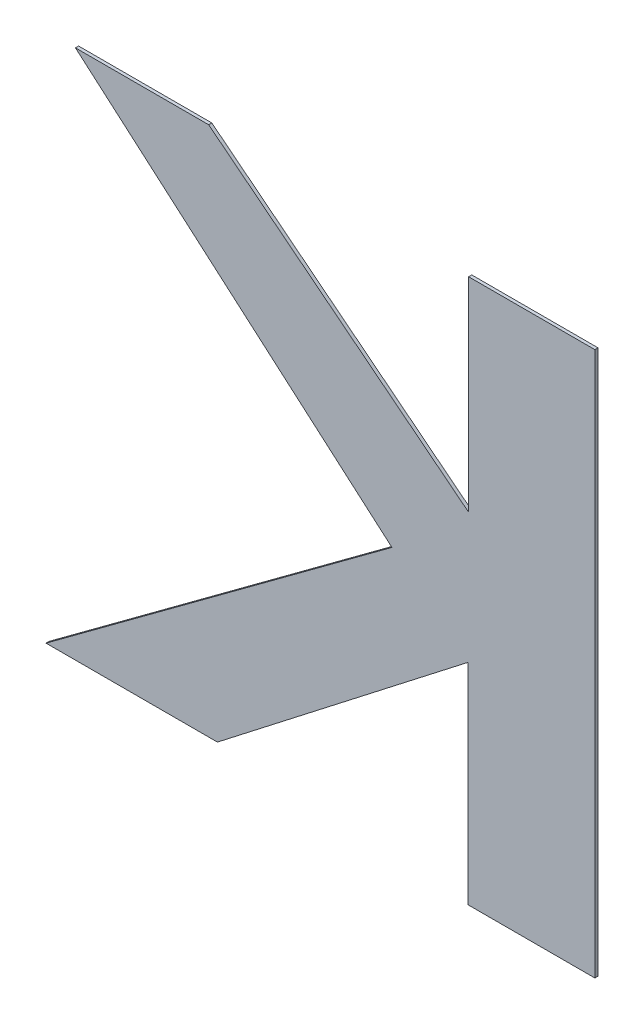
ISO-10303-21;
HEADER;
FILE_DESCRIPTION(('STEP AP214'),'2;1');
FILE_NAME('part.step','',(''),(''),'','','');
FILE_SCHEMA(('AUTOMOTIVE_DESIGN { 1 0 10303 214 1 1 1 1 }'));
ENDSEC;
DATA;
#1=APPLICATION_CONTEXT('core data for automotive mechanical design processes');
#2=APPLICATION_PROTOCOL_DEFINITION('international standard','automotive_design',2000,#1);
#3=PRODUCT_CONTEXT('',#1,'mechanical');
#4=PRODUCT('Part','Part','',(#3));
#5=PRODUCT_RELATED_PRODUCT_CATEGORY('part','',(#4));
#6=PRODUCT_DEFINITION_FORMATION('','',#4);
#7=PRODUCT_DEFINITION_CONTEXT('part definition',#1,'design');
#8=PRODUCT_DEFINITION('design','',#6,#7);
#9=PRODUCT_DEFINITION_SHAPE('','',#8);
#10=(LENGTH_UNIT() NAMED_UNIT(*) SI_UNIT(.MILLI.,.METRE.));
#11=(NAMED_UNIT(*) PLANE_ANGLE_UNIT() SI_UNIT($,.RADIAN.));
#12=(NAMED_UNIT(*) SI_UNIT($,.STERADIAN.) SOLID_ANGLE_UNIT());
#13=UNCERTAINTY_MEASURE_WITH_UNIT(LENGTH_MEASURE(1.E-05),#10,'distance_accuracy_value','');
#14=(GEOMETRIC_REPRESENTATION_CONTEXT(3) GLOBAL_UNCERTAINTY_ASSIGNED_CONTEXT((#13)) GLOBAL_UNIT_ASSIGNED_CONTEXT((#10,
#11,#12)) REPRESENTATION_CONTEXT('',''));
#15=CARTESIAN_POINT('',(0.,0.,0.));
#16=DIRECTION('',(0.,0.,1.));
#17=DIRECTION('',(1.,0.,0.));
#18=AXIS2_PLACEMENT_3D('',#15,#16,#17);
#19=CARTESIAN_POINT('',(0.27786395715,-16.68215910058,0.01));
#20=DIRECTION('',(0.,0.,1.));
#21=DIRECTION('',(1.,0.,0.));
#22=AXIS2_PLACEMENT_3D('',#19,#20,#21);
#23=PLANE('',#22);
#24=DIRECTION('',(0.,-1.,0.));
#25=VECTOR('',#24,1.);
#26=CARTESIAN_POINT('',(1.002394,-15.816008,0.01));
#27=LINE('',#26,#25);
#28=CARTESIAN_POINT('',(1.002394,-15.816008,0.01));
#29=VERTEX_POINT('',#28);
#30=CARTESIAN_POINT('',(1.002394,-17.548193,0.01));
#31=VERTEX_POINT('',#30);
#32=EDGE_CURVE('E133',#29,#31,#27,.T.);
#33=ORIENTED_EDGE('',*,*,#32,.F.);
#34=DIRECTION('',(1.,0.,0.));
#35=VECTOR('',#34,1.);
#36=CARTESIAN_POINT('',(0.600658,-15.816008,0.01));
#37=LINE('',#36,#35);
#38=CARTESIAN_POINT('',(0.600658,-15.816008,0.01));
#39=VERTEX_POINT('',#38);
#40=EDGE_CURVE('E27',#39,#29,#37,.T.);
#41=ORIENTED_EDGE('',*,*,#40,.F.);
#42=DIRECTION('',(0.,1.,0.));
#43=VECTOR('',#42,1.);
#44=CARTESIAN_POINT('',(0.600658,-16.465246,0.01));
#45=LINE('',#44,#43);
#46=CARTESIAN_POINT('',(0.600658,-16.465246,0.01));
#47=VERTEX_POINT('',#46);
#48=EDGE_CURVE('E104',#47,#39,#45,.T.);
#49=ORIENTED_EDGE('',*,*,#48,.F.);
#50=DIRECTION('',(0.784282454996758,-0.620403925506809,0.));
#51=VECTOR('',#50,1.);
#52=CARTESIAN_POINT('',(-0.226732,-15.810742,0.01));
#53=LINE('',#52,#51);
#54=CARTESIAN_POINT('',(-0.226732,-15.810742,0.01));
#55=VERTEX_POINT('',#54);
#56=EDGE_CURVE('E107',#55,#47,#53,.T.);
#57=ORIENTED_EDGE('',*,*,#56,.F.);
#58=DIRECTION('',(1.,0.,0.));
#59=VECTOR('',#58,1.);
#60=CARTESIAN_POINT('',(-0.650839,-15.810742,0.01));
#61=LINE('',#60,#59);
#62=CARTESIAN_POINT('',(-0.650839,-15.810742,0.01));
#63=VERTEX_POINT('',#62);
#64=EDGE_CURVE('E187',#63,#55,#61,.T.);
#65=ORIENTED_EDGE('',*,*,#64,.F.);
#66=DIRECTION('',(-0.755541525684926,0.655100757872936,0.));
#67=VECTOR('',#66,1.);
#68=CARTESIAN_POINT('',(0.356542,-16.684203,0.01));
#69=LINE('',#68,#67);
#70=CARTESIAN_POINT('',(0.356542,-16.684203,0.01));
#71=VERTEX_POINT('',#70);
#72=EDGE_CURVE('E216',#71,#63,#69,.T.);
#73=ORIENTED_EDGE('',*,*,#72,.F.);
#74=DIRECTION('',(0.803953002195116,0.594692836901085,0.));
#75=VECTOR('',#74,1.);
#76=CARTESIAN_POINT('',(-0.744434,-17.498607,0.01));
#77=LINE('',#76,#75);
#78=CARTESIAN_POINT('',(-0.744434,-17.498607,0.01));
#79=VERTEX_POINT('',#78);
#80=EDGE_CURVE('E160',#79,#71,#77,.T.);
#81=ORIENTED_EDGE('',*,*,#80,.F.);
#82=DIRECTION('',(-1.,0.,0.));
#83=VECTOR('',#82,1.);
#84=CARTESIAN_POINT('',(-0.198848,-17.498607,0.01));
#85=LINE('',#84,#83);
#86=CARTESIAN_POINT('',(-0.198848,-17.498607,0.01));
#87=VERTEX_POINT('',#86);
#88=EDGE_CURVE('E164',#87,#79,#85,.T.);
#89=ORIENTED_EDGE('',*,*,#88,.F.);
#90=DIRECTION('',(-0.790165318978317,-0.612893766230246,0.));
#91=VECTOR('',#90,1.);
#92=CARTESIAN_POINT('',(0.598567,-16.88009,0.01));
#93=LINE('',#92,#91);
#94=CARTESIAN_POINT('',(0.598567,-16.88009,0.01));
#95=VERTEX_POINT('',#94);
#96=EDGE_CURVE('E188',#95,#87,#93,.T.);
#97=ORIENTED_EDGE('',*,*,#96,.F.);
#98=DIRECTION('',(0.,1.,0.));
#99=VECTOR('',#98,1.);
#100=CARTESIAN_POINT('',(0.598567,-17.548193,0.01));
#101=LINE('',#100,#99);
#102=CARTESIAN_POINT('',(0.598567,-17.548193,0.01));
#103=VERTEX_POINT('',#102);
#104=EDGE_CURVE('E153',#103,#95,#101,.T.);
#105=ORIENTED_EDGE('',*,*,#104,.F.);
#106=DIRECTION('',(-1.,0.,0.));
#107=VECTOR('',#106,1.);
#108=CARTESIAN_POINT('',(1.002394,-17.548193,0.01));
#109=LINE('',#108,#107);
#110=EDGE_CURVE('E136',#31,#103,#109,.T.);
#111=ORIENTED_EDGE('',*,*,#110,.F.);
#112=EDGE_LOOP('',(#33,#41,#49,#57,#65,#73,#81,#89,#97,#105,#111));
#113=FACE_BOUND('',#112,.T.);
#114=ADVANCED_FACE('F17',(#113),#23,.T.);
#115=CARTESIAN_POINT('',(0.27786395715,-16.68215910058,0.));
#116=DIRECTION('',(0.,0.,1.));
#117=DIRECTION('',(1.,0.,0.));
#118=AXIS2_PLACEMENT_3D('',#115,#116,#117);
#119=PLANE('',#118);
#120=DIRECTION('',(0.,-1.,0.));
#121=VECTOR('',#120,1.);
#122=CARTESIAN_POINT('',(1.002394,-15.816008,0.));
#123=LINE('',#122,#121);
#124=CARTESIAN_POINT('',(1.002394,-15.816008,0.));
#125=VERTEX_POINT('',#124);
#126=CARTESIAN_POINT('',(1.002394,-17.548193,0.));
#127=VERTEX_POINT('',#126);
#128=EDGE_CURVE('E145',#125,#127,#123,.T.);
#129=ORIENTED_EDGE('',*,*,#128,.T.);
#130=DIRECTION('',(-1.,0.,0.));
#131=VECTOR('',#130,1.);
#132=CARTESIAN_POINT('',(1.002394,-17.548193,0.));
#133=LINE('',#132,#131);
#134=CARTESIAN_POINT('',(0.598567,-17.548193,0.));
#135=VERTEX_POINT('',#134);
#136=EDGE_CURVE('E151',#127,#135,#133,.T.);
#137=ORIENTED_EDGE('',*,*,#136,.T.);
#138=DIRECTION('',(0.,1.,0.));
#139=VECTOR('',#138,1.);
#140=CARTESIAN_POINT('',(0.598567,-17.548193,0.));
#141=LINE('',#140,#139);
#142=CARTESIAN_POINT('',(0.598567,-16.88009,0.));
#143=VERTEX_POINT('',#142);
#144=EDGE_CURVE('E183',#135,#143,#141,.T.);
#145=ORIENTED_EDGE('',*,*,#144,.T.);
#146=DIRECTION('',(-0.790165318978317,-0.612893766230246,0.));
#147=VECTOR('',#146,1.);
#148=CARTESIAN_POINT('',(0.598567,-16.88009,0.));
#149=LINE('',#148,#147);
#150=CARTESIAN_POINT('',(-0.198848,-17.498607,0.));
#151=VERTEX_POINT('',#150);
#152=EDGE_CURVE('E168',#143,#151,#149,.T.);
#153=ORIENTED_EDGE('',*,*,#152,.T.);
#154=DIRECTION('',(-1.,0.,0.));
#155=VECTOR('',#154,1.);
#156=CARTESIAN_POINT('',(-0.198848,-17.498607,0.));
#157=LINE('',#156,#155);
#158=CARTESIAN_POINT('',(-0.744434,-17.498607,0.));
#159=VERTEX_POINT('',#158);
#160=EDGE_CURVE('E156',#151,#159,#157,.T.);
#161=ORIENTED_EDGE('',*,*,#160,.T.);
#162=DIRECTION('',(0.803953002195116,0.594692836901085,0.));
#163=VECTOR('',#162,1.);
#164=CARTESIAN_POINT('',(-0.744434,-17.498607,0.));
#165=LINE('',#164,#163);
#166=CARTESIAN_POINT('',(0.356542,-16.684203,0.));
#167=VERTEX_POINT('',#166);
#168=EDGE_CURVE('E212',#159,#167,#165,.T.);
#169=ORIENTED_EDGE('',*,*,#168,.T.);
#170=DIRECTION('',(-0.755541525684926,0.655100757872936,0.));
#171=VECTOR('',#170,1.);
#172=CARTESIAN_POINT('',(0.356542,-16.684203,0.));
#173=LINE('',#172,#171);
#174=CARTESIAN_POINT('',(-0.650839,-15.810742,0.));
#175=VERTEX_POINT('',#174);
#176=EDGE_CURVE('E226',#167,#175,#173,.T.);
#177=ORIENTED_EDGE('',*,*,#176,.T.);
#178=DIRECTION('',(1.,0.,0.));
#179=VECTOR('',#178,1.);
#180=CARTESIAN_POINT('',(-0.650839,-15.810742,0.));
#181=LINE('',#180,#179);
#182=CARTESIAN_POINT('',(-0.226732,-15.810742,0.));
#183=VERTEX_POINT('',#182);
#184=EDGE_CURVE('E99',#175,#183,#181,.T.);
#185=ORIENTED_EDGE('',*,*,#184,.T.);
#186=DIRECTION('',(0.784282454996758,-0.620403925506809,0.));
#187=VECTOR('',#186,1.);
#188=CARTESIAN_POINT('',(-0.226732,-15.810742,0.));
#189=LINE('',#188,#187);
#190=CARTESIAN_POINT('',(0.600658,-16.465246,0.));
#191=VERTEX_POINT('',#190);
#192=EDGE_CURVE('E96',#183,#191,#189,.T.);
#193=ORIENTED_EDGE('',*,*,#192,.T.);
#194=DIRECTION('',(0.,1.,0.));
#195=VECTOR('',#194,1.);
#196=CARTESIAN_POINT('',(0.600658,-16.465246,0.));
#197=LINE('',#196,#195);
#198=CARTESIAN_POINT('',(0.600658,-15.816008,0.));
#199=VERTEX_POINT('',#198);
#200=EDGE_CURVE('E84',#191,#199,#197,.T.);
#201=ORIENTED_EDGE('',*,*,#200,.T.);
#202=DIRECTION('',(1.,0.,0.));
#203=VECTOR('',#202,1.);
#204=CARTESIAN_POINT('',(0.600658,-15.816008,0.));
#205=LINE('',#204,#203);
#206=EDGE_CURVE('E11',#199,#125,#205,.T.);
#207=ORIENTED_EDGE('',*,*,#206,.T.);
#208=EDGE_LOOP('',(#129,#137,#145,#153,#161,#169,#177,#185,#193,#201,#207));
#209=FACE_BOUND('',#208,.T.);
#210=ADVANCED_FACE('F19',(#209),#119,.F.);
#211=CARTESIAN_POINT('',(0.600658,-15.816008,0.));
#212=DIRECTION('',(0.,1.,0.));
#213=DIRECTION('',(1.,0.,0.));
#214=AXIS2_PLACEMENT_3D('',#211,#212,#213);
#215=PLANE('',#214);
#216=DIRECTION('',(0.,0.,1.));
#217=VECTOR('',#216,1.);
#218=CARTESIAN_POINT('',(0.600658,-15.816008,0.));
#219=LINE('',#218,#217);
#220=EDGE_CURVE('E91',#199,#39,#219,.T.);
#221=ORIENTED_EDGE('',*,*,#220,.T.);
#222=ORIENTED_EDGE('',*,*,#40,.T.);
#223=DIRECTION('',(0.,0.,1.));
#224=VECTOR('',#223,1.);
#225=CARTESIAN_POINT('',(1.002394,-15.816008,0.));
#226=LINE('',#225,#224);
#227=EDGE_CURVE('E126',#125,#29,#226,.T.);
#228=ORIENTED_EDGE('',*,*,#227,.F.);
#229=ORIENTED_EDGE('',*,*,#206,.F.);
#230=EDGE_LOOP('',(#221,#222,#228,#229));
#231=FACE_BOUND('',#230,.T.);
#232=ADVANCED_FACE('F123',(#231),#215,.T.);
#233=CARTESIAN_POINT('',(0.600658,-16.465246,0.));
#234=DIRECTION('',(-1.,0.,0.));
#235=DIRECTION('',(0.,0.,1.));
#236=AXIS2_PLACEMENT_3D('',#233,#234,#235);
#237=PLANE('',#236);
#238=DIRECTION('',(0.,0.,1.));
#239=VECTOR('',#238,1.);
#240=CARTESIAN_POINT('',(0.600658,-16.465246,0.));
#241=LINE('',#240,#239);
#242=EDGE_CURVE('E89',#191,#47,#241,.T.);
#243=ORIENTED_EDGE('',*,*,#242,.T.);
#244=ORIENTED_EDGE('',*,*,#48,.T.);
#245=ORIENTED_EDGE('',*,*,#220,.F.);
#246=ORIENTED_EDGE('',*,*,#200,.F.);
#247=EDGE_LOOP('',(#243,#244,#245,#246));
#248=FACE_BOUND('',#247,.T.);
#249=ADVANCED_FACE('F86',(#248),#237,.T.);
#250=CARTESIAN_POINT('',(-0.226732,-15.810742,0.));
#251=DIRECTION('',(0.620403925506809,0.784282454996758,0.));
#252=DIRECTION('',(0.,0.,-1.));
#253=AXIS2_PLACEMENT_3D('',#250,#251,#252);
#254=PLANE('',#253);
#255=DIRECTION('',(0.,0.,1.));
#256=VECTOR('',#255,1.);
#257=CARTESIAN_POINT('',(-0.226732,-15.810742,0.));
#258=LINE('',#257,#256);
#259=EDGE_CURVE('E184',#183,#55,#258,.T.);
#260=ORIENTED_EDGE('',*,*,#259,.T.);
#261=ORIENTED_EDGE('',*,*,#56,.T.);
#262=ORIENTED_EDGE('',*,*,#242,.F.);
#263=ORIENTED_EDGE('',*,*,#192,.F.);
#264=EDGE_LOOP('',(#260,#261,#262,#263));
#265=FACE_BOUND('',#264,.T.);
#266=ADVANCED_FACE('F106',(#265),#254,.T.);
#267=CARTESIAN_POINT('',(-0.650839,-15.810742,0.));
#268=DIRECTION('',(0.,1.,0.));
#269=DIRECTION('',(1.,0.,0.));
#270=AXIS2_PLACEMENT_3D('',#267,#268,#269);
#271=PLANE('',#270);
#272=DIRECTION('',(0.,0.,1.));
#273=VECTOR('',#272,1.);
#274=CARTESIAN_POINT('',(-0.650839,-15.810742,0.));
#275=LINE('',#274,#273);
#276=EDGE_CURVE('E220',#175,#63,#275,.T.);
#277=ORIENTED_EDGE('',*,*,#276,.T.);
#278=ORIENTED_EDGE('',*,*,#64,.T.);
#279=ORIENTED_EDGE('',*,*,#259,.F.);
#280=ORIENTED_EDGE('',*,*,#184,.F.);
#281=EDGE_LOOP('',(#277,#278,#279,#280));
#282=FACE_BOUND('',#281,.T.);
#283=ADVANCED_FACE('F232',(#282),#271,.T.);
#284=CARTESIAN_POINT('',(0.356542,-16.684203,0.));
#285=DIRECTION('',(-0.655100757872936,-0.755541525684926,0.));
#286=DIRECTION('',(-0.755541525684926,0.655100757872936,0.));
#287=AXIS2_PLACEMENT_3D('',#284,#285,#286);
#288=PLANE('',#287);
#289=DIRECTION('',(0.,0.,1.));
#290=VECTOR('',#289,1.);
#291=CARTESIAN_POINT('',(0.356542,-16.684203,0.));
#292=LINE('',#291,#290);
#293=EDGE_CURVE('E208',#167,#71,#292,.T.);
#294=ORIENTED_EDGE('',*,*,#293,.T.);
#295=ORIENTED_EDGE('',*,*,#72,.T.);
#296=ORIENTED_EDGE('',*,*,#276,.F.);
#297=ORIENTED_EDGE('',*,*,#176,.F.);
#298=EDGE_LOOP('',(#294,#295,#296,#297));
#299=FACE_BOUND('',#298,.T.);
#300=ADVANCED_FACE('F241',(#299),#288,.T.);
#301=CARTESIAN_POINT('',(-0.744434,-17.498607,0.));
#302=DIRECTION('',(-0.594692836901085,0.803953002195116,0.));
#303=DIRECTION('',(0.,0.,1.));
#304=AXIS2_PLACEMENT_3D('',#301,#302,#303);
#305=PLANE('',#304);
#306=DIRECTION('',(0.,0.,1.));
#307=VECTOR('',#306,1.);
#308=CARTESIAN_POINT('',(-0.744434,-17.498607,0.));
#309=LINE('',#308,#307);
#310=EDGE_CURVE('E161',#159,#79,#309,.T.);
#311=ORIENTED_EDGE('',*,*,#310,.T.);
#312=ORIENTED_EDGE('',*,*,#80,.T.);
#313=ORIENTED_EDGE('',*,*,#293,.F.);
#314=ORIENTED_EDGE('',*,*,#168,.F.);
#315=EDGE_LOOP('',(#311,#312,#313,#314));
#316=FACE_BOUND('',#315,.T.);
#317=ADVANCED_FACE('F244',(#316),#305,.T.);
#318=CARTESIAN_POINT('',(-0.198848,-17.498607,0.));
#319=DIRECTION('',(0.,-1.,0.));
#320=DIRECTION('',(0.,0.,-1.));
#321=AXIS2_PLACEMENT_3D('',#318,#319,#320);
#322=PLANE('',#321);
#323=DIRECTION('',(0.,0.,1.));
#324=VECTOR('',#323,1.);
#325=CARTESIAN_POINT('',(-0.198848,-17.498607,0.));
#326=LINE('',#325,#324);
#327=EDGE_CURVE('E192',#151,#87,#326,.T.);
#328=ORIENTED_EDGE('',*,*,#327,.T.);
#329=ORIENTED_EDGE('',*,*,#88,.T.);
#330=ORIENTED_EDGE('',*,*,#310,.F.);
#331=ORIENTED_EDGE('',*,*,#160,.F.);
#332=EDGE_LOOP('',(#328,#329,#330,#331));
#333=FACE_BOUND('',#332,.T.);
#334=ADVANCED_FACE('F247',(#333),#322,.T.);
#335=CARTESIAN_POINT('',(0.598567,-16.88009,0.));
#336=DIRECTION('',(0.612893766230246,-0.790165318978317,0.));
#337=DIRECTION('',(0.,0.,-1.));
#338=AXIS2_PLACEMENT_3D('',#335,#336,#337);
#339=PLANE('',#338);
#340=DIRECTION('',(0.,0.,1.));
#341=VECTOR('',#340,1.);
#342=CARTESIAN_POINT('',(0.598567,-16.88009,0.));
#343=LINE('',#342,#341);
#344=EDGE_CURVE('E179',#143,#95,#343,.T.);
#345=ORIENTED_EDGE('',*,*,#344,.T.);
#346=ORIENTED_EDGE('',*,*,#96,.T.);
#347=ORIENTED_EDGE('',*,*,#327,.F.);
#348=ORIENTED_EDGE('',*,*,#152,.F.);
#349=EDGE_LOOP('',(#345,#346,#347,#348));
#350=FACE_BOUND('',#349,.T.);
#351=ADVANCED_FACE('F258',(#350),#339,.T.);
#352=CARTESIAN_POINT('',(0.598567,-17.548193,0.));
#353=DIRECTION('',(-1.,0.,0.));
#354=DIRECTION('',(0.,0.,1.));
#355=AXIS2_PLACEMENT_3D('',#352,#353,#354);
#356=PLANE('',#355);
#357=DIRECTION('',(0.,0.,1.));
#358=VECTOR('',#357,1.);
#359=CARTESIAN_POINT('',(0.598567,-17.548193,0.));
#360=LINE('',#359,#358);
#361=EDGE_CURVE('E154',#135,#103,#360,.T.);
#362=ORIENTED_EDGE('',*,*,#361,.T.);
#363=ORIENTED_EDGE('',*,*,#104,.T.);
#364=ORIENTED_EDGE('',*,*,#344,.F.);
#365=ORIENTED_EDGE('',*,*,#144,.F.);
#366=EDGE_LOOP('',(#362,#363,#364,#365));
#367=FACE_BOUND('',#366,.T.);
#368=ADVANCED_FACE('F261',(#367),#356,.T.);
#369=CARTESIAN_POINT('',(1.002394,-17.548193,0.));
#370=DIRECTION('',(0.,-1.,0.));
#371=DIRECTION('',(0.,0.,-1.));
#372=AXIS2_PLACEMENT_3D('',#369,#370,#371);
#373=PLANE('',#372);
#374=DIRECTION('',(0.,0.,1.));
#375=VECTOR('',#374,1.);
#376=CARTESIAN_POINT('',(1.002394,-17.548193,0.));
#377=LINE('',#376,#375);
#378=EDGE_CURVE('E141',#127,#31,#377,.T.);
#379=ORIENTED_EDGE('',*,*,#378,.T.);
#380=ORIENTED_EDGE('',*,*,#110,.T.);
#381=ORIENTED_EDGE('',*,*,#361,.F.);
#382=ORIENTED_EDGE('',*,*,#136,.F.);
#383=EDGE_LOOP('',(#379,#380,#381,#382));
#384=FACE_BOUND('',#383,.T.);
#385=ADVANCED_FACE('F268',(#384),#373,.T.);
#386=CARTESIAN_POINT('',(1.002394,-15.816008,0.));
#387=DIRECTION('',(1.,0.,0.));
#388=DIRECTION('',(0.,1.,0.));
#389=AXIS2_PLACEMENT_3D('',#386,#387,#388);
#390=PLANE('',#389);
#391=ORIENTED_EDGE('',*,*,#227,.T.);
#392=ORIENTED_EDGE('',*,*,#32,.T.);
#393=ORIENTED_EDGE('',*,*,#378,.F.);
#394=ORIENTED_EDGE('',*,*,#128,.F.);
#395=EDGE_LOOP('',(#391,#392,#393,#394));
#396=FACE_BOUND('',#395,.T.);
#397=ADVANCED_FACE('F144',(#396),#390,.T.);
#398=CLOSED_SHELL('',(#114,#210,#232,#249,#266,#283,#300,#317,#334,#351,#368,#385,#397));
#399=MANIFOLD_SOLID_BREP('B1',#398);
#400=ADVANCED_BREP_SHAPE_REPRESENTATION('',(#18,#399),#14);
#401=SHAPE_DEFINITION_REPRESENTATION(#9,#400);
ENDSEC;
END-ISO-10303-21;
